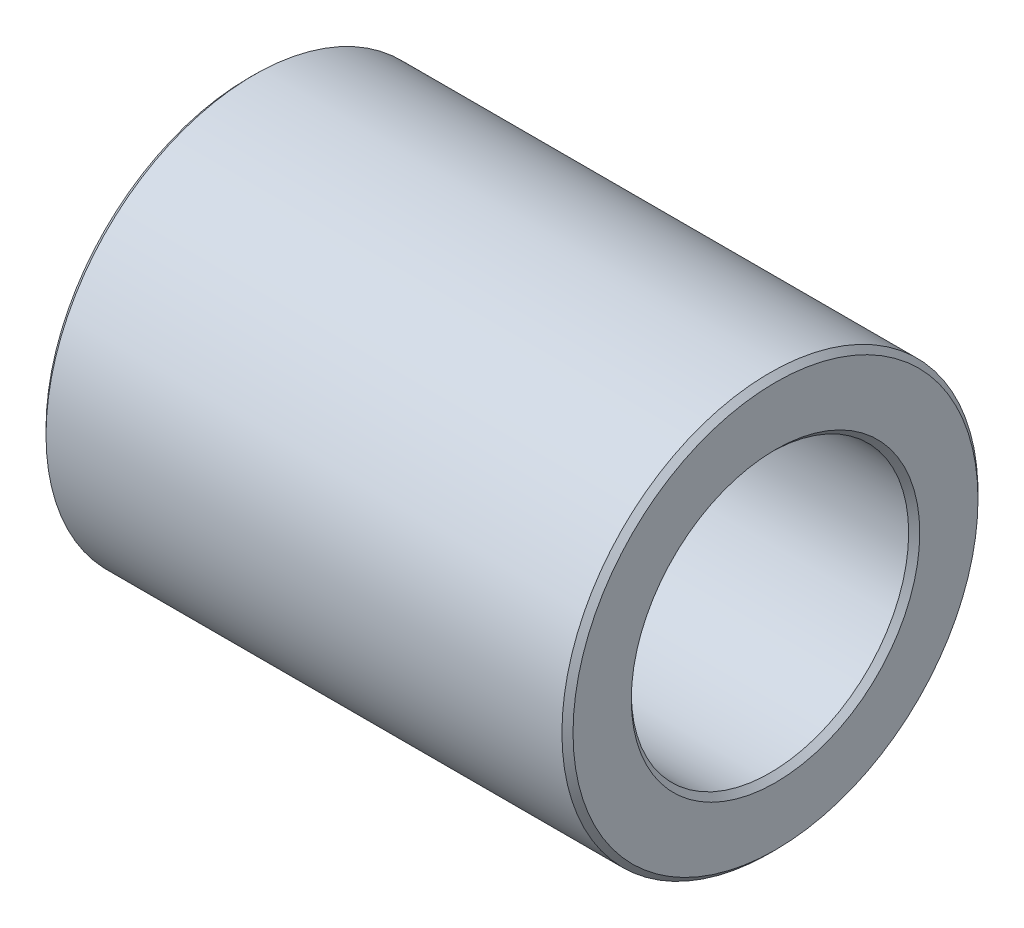
ISO-10303-21;
HEADER;
FILE_DESCRIPTION(('STEP AP214'),'2;1');
FILE_NAME('part.step','',(''),(''),'','','');
FILE_SCHEMA(('AUTOMOTIVE_DESIGN { 1 0 10303 214 1 1 1 1 }'));
ENDSEC;
DATA;
#1=APPLICATION_CONTEXT('core data for automotive mechanical design processes');
#2=APPLICATION_PROTOCOL_DEFINITION('international standard','automotive_design',2000,#1);
#3=PRODUCT_CONTEXT('',#1,'mechanical');
#4=PRODUCT('Part','Part','',(#3));
#5=PRODUCT_RELATED_PRODUCT_CATEGORY('part','',(#4));
#6=PRODUCT_DEFINITION_FORMATION('','',#4);
#7=PRODUCT_DEFINITION_CONTEXT('part definition',#1,'design');
#8=PRODUCT_DEFINITION('design','',#6,#7);
#9=PRODUCT_DEFINITION_SHAPE('','',#8);
#10=(LENGTH_UNIT() NAMED_UNIT(*) SI_UNIT(.MILLI.,.METRE.));
#11=(NAMED_UNIT(*) PLANE_ANGLE_UNIT() SI_UNIT($,.RADIAN.));
#12=(NAMED_UNIT(*) SI_UNIT($,.STERADIAN.) SOLID_ANGLE_UNIT());
#13=UNCERTAINTY_MEASURE_WITH_UNIT(LENGTH_MEASURE(1.E-05),#10,'distance_accuracy_value','');
#14=(GEOMETRIC_REPRESENTATION_CONTEXT(3) GLOBAL_UNCERTAINTY_ASSIGNED_CONTEXT((#13)) GLOBAL_UNIT_ASSIGNED_CONTEXT((#10,
#11,#12)) REPRESENTATION_CONTEXT('',''));
#15=CARTESIAN_POINT('',(0.,0.,0.));
#16=DIRECTION('',(0.,0.,1.));
#17=DIRECTION('',(1.,0.,0.));
#18=AXIS2_PLACEMENT_3D('',#15,#16,#17);
#19=CARTESIAN_POINT('',(0.,0.,0.));
#20=DIRECTION('',(1.,0.,0.));
#21=DIRECTION('',(0.,0.,-1.));
#22=AXIS2_PLACEMENT_3D('',#19,#20,#21);
#23=PLANE('',#22);
#24=CARTESIAN_POINT('',(0.,0.,0.));
#25=DIRECTION('',(1.,0.,0.));
#26=DIRECTION('',(0.,0.,-1.));
#27=AXIS2_PLACEMENT_3D('',#24,#25,#26);
#28=CIRCLE('',#27,7.29999999999999);
#29=CARTESIAN_POINT('',(0.,0.,-7.29999999999999));
#30=VERTEX_POINT('',#29);
#31=EDGE_CURVE('E10',#30,#30,#28,.F.);
#32=ORIENTED_EDGE('',*,*,#31,.T.);
#33=EDGE_LOOP('',(#32));
#34=FACE_BOUND('',#33,.T.);
#35=CARTESIAN_POINT('',(0.,0.,0.));
#36=DIRECTION('',(1.,0.,0.));
#37=DIRECTION('',(0.,0.,-1.));
#38=AXIS2_PLACEMENT_3D('',#35,#36,#37);
#39=CIRCLE('',#38,5.2);
#40=CARTESIAN_POINT('',(0.,0.,-5.2));
#41=VERTEX_POINT('',#40);
#42=EDGE_CURVE('E41',#41,#41,#39,.T.);
#43=ORIENTED_EDGE('',*,*,#42,.T.);
#44=EDGE_LOOP('',(#43));
#45=FACE_BOUND('',#44,.T.);
#46=ADVANCED_FACE('F34',(#34,#45),#23,.F.);
#47=CARTESIAN_POINT('',(0.,0.,0.));
#48=DIRECTION('',(-1.,0.,0.));
#49=DIRECTION('',(0.,0.,1.));
#50=AXIS2_PLACEMENT_3D('',#47,#48,#49);
#51=CYLINDRICAL_SURFACE('',#50,7.5);
#52=CARTESIAN_POINT('',(18.8,0.,0.));
#53=DIRECTION('',(-1.,0.,0.));
#54=DIRECTION('',(0.,0.,1.));
#55=AXIS2_PLACEMENT_3D('',#52,#53,#54);
#56=CIRCLE('',#55,7.5);
#57=CARTESIAN_POINT('',(18.8,0.,7.5));
#58=VERTEX_POINT('',#57);
#59=EDGE_CURVE('E60',#58,#58,#56,.T.);
#60=ORIENTED_EDGE('',*,*,#59,.T.);
#61=EDGE_LOOP('',(#60));
#62=FACE_BOUND('',#61,.T.);
#63=CARTESIAN_POINT('',(0.200000000000012,0.,0.));
#64=DIRECTION('',(1.,0.,0.));
#65=DIRECTION('',(0.,0.,-1.));
#66=AXIS2_PLACEMENT_3D('',#63,#64,#65);
#67=CIRCLE('',#66,7.5);
#68=CARTESIAN_POINT('',(0.200000000000012,0.,-7.5));
#69=VERTEX_POINT('',#68);
#70=EDGE_CURVE('E63',#69,#69,#67,.T.);
#71=ORIENTED_EDGE('',*,*,#70,.T.);
#72=EDGE_LOOP('',(#71));
#73=FACE_BOUND('',#72,.T.);
#74=ADVANCED_FACE('F67',(#62,#73),#51,.T.);
#75=CARTESIAN_POINT('',(19.,0.,0.));
#76=DIRECTION('',(-1.,0.,0.));
#77=DIRECTION('',(0.,0.,1.));
#78=AXIS2_PLACEMENT_3D('',#75,#76,#77);
#79=PLANE('',#78);
#80=CARTESIAN_POINT('',(19.,0.,0.));
#81=DIRECTION('',(-1.,0.,0.));
#82=DIRECTION('',(0.,0.,1.));
#83=AXIS2_PLACEMENT_3D('',#80,#81,#82);
#84=CIRCLE('',#83,7.3);
#85=CARTESIAN_POINT('',(19.,0.,7.3));
#86=VERTEX_POINT('',#85);
#87=EDGE_CURVE('E54',#86,#86,#84,.F.);
#88=ORIENTED_EDGE('',*,*,#87,.T.);
#89=EDGE_LOOP('',(#88));
#90=FACE_BOUND('',#89,.T.);
#91=CARTESIAN_POINT('',(19.,0.,0.));
#92=DIRECTION('',(-1.,0.,0.));
#93=DIRECTION('',(0.,0.,1.));
#94=AXIS2_PLACEMENT_3D('',#91,#92,#93);
#95=CIRCLE('',#94,5.2);
#96=CARTESIAN_POINT('',(19.,0.,5.2));
#97=VERTEX_POINT('',#96);
#98=EDGE_CURVE('E57',#97,#97,#95,.T.);
#99=ORIENTED_EDGE('',*,*,#98,.T.);
#100=EDGE_LOOP('',(#99));
#101=FACE_BOUND('',#100,.T.);
#102=ADVANCED_FACE('F86',(#90,#101),#79,.F.);
#103=CARTESIAN_POINT('',(0.,0.,0.));
#104=DIRECTION('',(-1.,0.,0.));
#105=DIRECTION('',(0.,0.,1.));
#106=AXIS2_PLACEMENT_3D('',#103,#104,#105);
#107=CYLINDRICAL_SURFACE('',#106,5.);
#108=CARTESIAN_POINT('',(18.8,0.,0.));
#109=DIRECTION('',(-1.,0.,0.));
#110=DIRECTION('',(0.,0.,1.));
#111=AXIS2_PLACEMENT_3D('',#108,#109,#110);
#112=CIRCLE('',#111,5.);
#113=CARTESIAN_POINT('',(18.8,0.,5.));
#114=VERTEX_POINT('',#113);
#115=EDGE_CURVE('E45',#114,#114,#112,.F.);
#116=ORIENTED_EDGE('',*,*,#115,.T.);
#117=EDGE_LOOP('',(#116));
#118=FACE_BOUND('',#117,.T.);
#119=CARTESIAN_POINT('',(0.199999999999997,0.,0.));
#120=DIRECTION('',(1.,0.,0.));
#121=DIRECTION('',(0.,0.,-1.));
#122=AXIS2_PLACEMENT_3D('',#119,#120,#121);
#123=CIRCLE('',#122,5.);
#124=CARTESIAN_POINT('',(0.199999999999997,0.,-5.));
#125=VERTEX_POINT('',#124);
#126=EDGE_CURVE('E49',#125,#125,#123,.F.);
#127=ORIENTED_EDGE('',*,*,#126,.T.);
#128=EDGE_LOOP('',(#127));
#129=FACE_BOUND('',#128,.T.);
#130=ADVANCED_FACE('F92',(#118,#129),#107,.F.);
#131=CARTESIAN_POINT('',(18.8,0.,0.));
#132=DIRECTION('',(-1.,0.,0.));
#133=DIRECTION('',(0.,0.,1.));
#134=AXIS2_PLACEMENT_3D('',#131,#132,#133);
#135=CONICAL_SURFACE('',#134,7.5,0.785398163397444);
#136=ORIENTED_EDGE('',*,*,#87,.F.);
#137=EDGE_LOOP('',(#136));
#138=FACE_BOUND('',#137,.T.);
#139=ORIENTED_EDGE('',*,*,#59,.F.);
#140=EDGE_LOOP('',(#139));
#141=FACE_BOUND('',#140,.T.);
#142=ADVANCED_FACE('F78',(#138,#141),#135,.T.);
#143=CARTESIAN_POINT('',(19.,0.,0.));
#144=DIRECTION('',(1.,0.,0.));
#145=DIRECTION('',(0.,0.,-1.));
#146=AXIS2_PLACEMENT_3D('',#143,#144,#145);
#147=CONICAL_SURFACE('',#146,5.2,0.785398163397433);
#148=ORIENTED_EDGE('',*,*,#115,.F.);
#149=EDGE_LOOP('',(#148));
#150=FACE_BOUND('',#149,.T.);
#151=ORIENTED_EDGE('',*,*,#98,.F.);
#152=EDGE_LOOP('',(#151));
#153=FACE_BOUND('',#152,.T.);
#154=ADVANCED_FACE('F72',(#150,#153),#147,.F.);
#155=CARTESIAN_POINT('',(0.,0.,0.));
#156=DIRECTION('',(1.,0.,0.));
#157=DIRECTION('',(0.,0.,-1.));
#158=AXIS2_PLACEMENT_3D('',#155,#156,#157);
#159=CONICAL_SURFACE('',#158,7.29999999999999,0.785398163397444);
#160=ORIENTED_EDGE('',*,*,#70,.F.);
#161=EDGE_LOOP('',(#160));
#162=FACE_BOUND('',#161,.T.);
#163=ORIENTED_EDGE('',*,*,#31,.F.);
#164=EDGE_LOOP('',(#163));
#165=FACE_BOUND('',#164,.T.);
#166=ADVANCED_FACE('F69',(#162,#165),#159,.T.);
#167=CARTESIAN_POINT('',(0.199999999999997,0.,0.));
#168=DIRECTION('',(-1.,0.,0.));
#169=DIRECTION('',(0.,0.,1.));
#170=AXIS2_PLACEMENT_3D('',#167,#168,#169);
#171=CONICAL_SURFACE('',#170,5.,0.785398163397457);
#172=ORIENTED_EDGE('',*,*,#42,.F.);
#173=EDGE_LOOP('',(#172));
#174=FACE_BOUND('',#173,.T.);
#175=ORIENTED_EDGE('',*,*,#126,.F.);
#176=EDGE_LOOP('',(#175));
#177=FACE_BOUND('',#176,.T.);
#178=ADVANCED_FACE('F36',(#174,#177),#171,.F.);
#179=CLOSED_SHELL('',(#46,#74,#102,#130,#142,#154,#166,#178));
#180=MANIFOLD_SOLID_BREP('B2',#179);
#181=ADVANCED_BREP_SHAPE_REPRESENTATION('',(#18,#180),#14);
#182=SHAPE_DEFINITION_REPRESENTATION(#9,#181);
ENDSEC;
END-ISO-10303-21;
